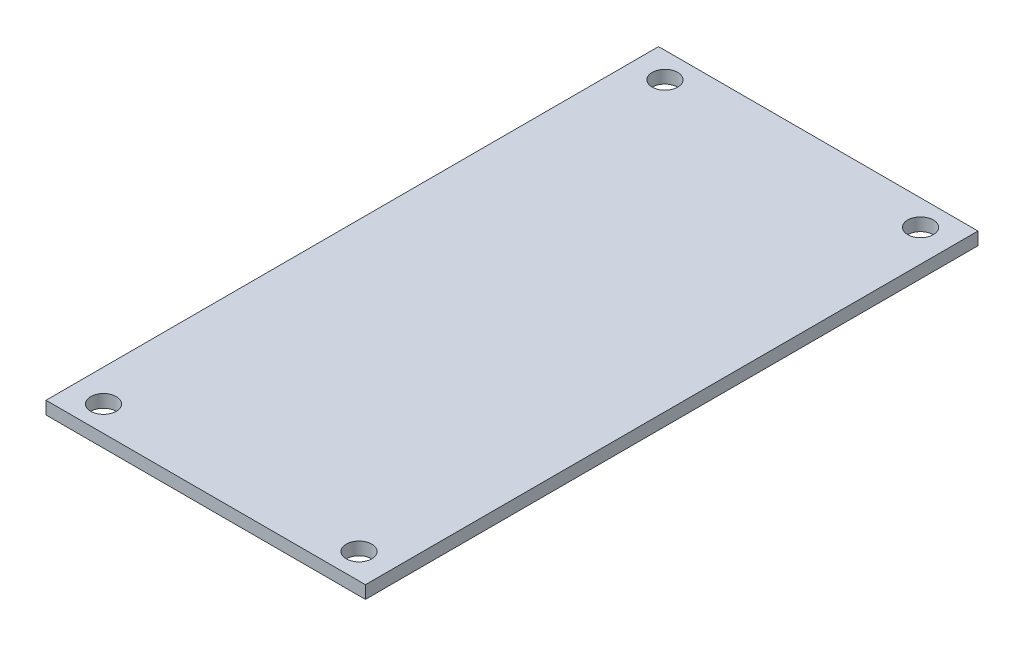
ISO-10303-21;
HEADER;
FILE_DESCRIPTION(('STEP AP214'),'2;1');
FILE_NAME('part.step','',(''),(''),'','','');
FILE_SCHEMA(('AUTOMOTIVE_DESIGN { 1 0 10303 214 1 1 1 1 }'));
ENDSEC;
DATA;
#1=APPLICATION_CONTEXT('core data for automotive mechanical design processes');
#2=APPLICATION_PROTOCOL_DEFINITION('international standard','automotive_design',2000,#1);
#3=PRODUCT_CONTEXT('',#1,'mechanical');
#4=PRODUCT('Part','Part','',(#3));
#5=PRODUCT_RELATED_PRODUCT_CATEGORY('part','',(#4));
#6=PRODUCT_DEFINITION_FORMATION('','',#4);
#7=PRODUCT_DEFINITION_CONTEXT('part definition',#1,'design');
#8=PRODUCT_DEFINITION('design','',#6,#7);
#9=PRODUCT_DEFINITION_SHAPE('','',#8);
#10=(LENGTH_UNIT() NAMED_UNIT(*) SI_UNIT(.MILLI.,.METRE.));
#11=(NAMED_UNIT(*) PLANE_ANGLE_UNIT() SI_UNIT($,.RADIAN.));
#12=(NAMED_UNIT(*) SI_UNIT($,.STERADIAN.) SOLID_ANGLE_UNIT());
#13=UNCERTAINTY_MEASURE_WITH_UNIT(LENGTH_MEASURE(1.E-05),#10,'distance_accuracy_value','');
#14=(GEOMETRIC_REPRESENTATION_CONTEXT(3) GLOBAL_UNCERTAINTY_ASSIGNED_CONTEXT((#13)) GLOBAL_UNIT_ASSIGNED_CONTEXT((#10,
#11,#12)) REPRESENTATION_CONTEXT('',''));
#15=CARTESIAN_POINT('',(0.,0.,0.));
#16=DIRECTION('',(0.,0.,1.));
#17=DIRECTION('',(1.,0.,0.));
#18=AXIS2_PLACEMENT_3D('',#15,#16,#17);
#19=CARTESIAN_POINT('',(0.,5.,0.));
#20=DIRECTION('',(1.,0.,0.));
#21=DIRECTION('',(0.,0.,-1.));
#22=AXIS2_PLACEMENT_3D('',#19,#20,#21);
#23=PLANE('',#22);
#24=DIRECTION('',(0.,0.,1.));
#25=VECTOR('',#24,1.);
#26=CARTESIAN_POINT('',(0.,0.,0.));
#27=LINE('',#26,#25);
#28=CARTESIAN_POINT('',(0.,0.,0.));
#29=VERTEX_POINT('',#28);
#30=CARTESIAN_POINT('',(0.,0.,239.7125));
#31=VERTEX_POINT('',#30);
#32=EDGE_CURVE('E105',#29,#31,#27,.T.);
#33=ORIENTED_EDGE('',*,*,#32,.T.);
#34=DIRECTION('',(0.,-1.,0.));
#35=VECTOR('',#34,1.);
#36=CARTESIAN_POINT('',(0.,5.,239.7125));
#37=LINE('',#36,#35);
#38=CARTESIAN_POINT('',(0.,5.,239.7125));
#39=VERTEX_POINT('',#38);
#40=EDGE_CURVE('E11',#39,#31,#37,.T.);
#41=ORIENTED_EDGE('',*,*,#40,.F.);
#42=DIRECTION('',(0.,0.,1.));
#43=VECTOR('',#42,1.);
#44=CARTESIAN_POINT('',(0.,5.,0.));
#45=LINE('',#44,#43);
#46=CARTESIAN_POINT('',(0.,5.,0.));
#47=VERTEX_POINT('',#46);
#48=EDGE_CURVE('E93',#47,#39,#45,.T.);
#49=ORIENTED_EDGE('',*,*,#48,.F.);
#50=DIRECTION('',(0.,-1.,0.));
#51=VECTOR('',#50,1.);
#52=CARTESIAN_POINT('',(0.,5.,0.));
#53=LINE('',#52,#51);
#54=EDGE_CURVE('E101',#47,#29,#53,.T.);
#55=ORIENTED_EDGE('',*,*,#54,.T.);
#56=EDGE_LOOP('',(#33,#41,#49,#55));
#57=FACE_BOUND('',#56,.T.);
#58=ADVANCED_FACE('F42',(#57),#23,.F.);
#59=CARTESIAN_POINT('',(0.,5.,239.7125));
#60=DIRECTION('',(0.,0.,-1.));
#61=DIRECTION('',(-1.,0.,0.));
#62=AXIS2_PLACEMENT_3D('',#59,#60,#61);
#63=PLANE('',#62);
#64=DIRECTION('',(1.,0.,0.));
#65=VECTOR('',#64,1.);
#66=CARTESIAN_POINT('',(0.,0.,239.7125));
#67=LINE('',#66,#65);
#68=CARTESIAN_POINT('',(125.,0.,239.7125));
#69=VERTEX_POINT('',#68);
#70=EDGE_CURVE('E97',#31,#69,#67,.T.);
#71=ORIENTED_EDGE('',*,*,#70,.T.);
#72=DIRECTION('',(0.,-1.,0.));
#73=VECTOR('',#72,1.);
#74=CARTESIAN_POINT('',(125.,5.,239.7125));
#75=LINE('',#74,#73);
#76=CARTESIAN_POINT('',(125.,5.,239.7125));
#77=VERTEX_POINT('',#76);
#78=EDGE_CURVE('E50',#77,#69,#75,.T.);
#79=ORIENTED_EDGE('',*,*,#78,.F.);
#80=DIRECTION('',(1.,0.,0.));
#81=VECTOR('',#80,1.);
#82=CARTESIAN_POINT('',(0.,5.,239.7125));
#83=LINE('',#82,#81);
#84=EDGE_CURVE('E88',#39,#77,#83,.T.);
#85=ORIENTED_EDGE('',*,*,#84,.F.);
#86=ORIENTED_EDGE('',*,*,#40,.T.);
#87=EDGE_LOOP('',(#71,#79,#85,#86));
#88=FACE_BOUND('',#87,.T.);
#89=ADVANCED_FACE('F96',(#88),#63,.F.);
#90=CARTESIAN_POINT('',(125.,5.,0.));
#91=DIRECTION('',(-1.,0.,0.));
#92=DIRECTION('',(0.,0.,1.));
#93=AXIS2_PLACEMENT_3D('',#90,#91,#92);
#94=PLANE('',#93);
#95=DIRECTION('',(0.,0.,-1.));
#96=VECTOR('',#95,1.);
#97=CARTESIAN_POINT('',(125.,0.,0.));
#98=LINE('',#97,#96);
#99=CARTESIAN_POINT('',(125.,0.,0.));
#100=VERTEX_POINT('',#99);
#101=EDGE_CURVE('E75',#69,#100,#98,.T.);
#102=ORIENTED_EDGE('',*,*,#101,.T.);
#103=DIRECTION('',(0.,-1.,0.));
#104=VECTOR('',#103,1.);
#105=CARTESIAN_POINT('',(125.,5.,0.));
#106=LINE('',#105,#104);
#107=CARTESIAN_POINT('',(125.,5.,0.));
#108=VERTEX_POINT('',#107);
#109=EDGE_CURVE('E98',#108,#100,#106,.T.);
#110=ORIENTED_EDGE('',*,*,#109,.F.);
#111=DIRECTION('',(0.,0.,-1.));
#112=VECTOR('',#111,1.);
#113=CARTESIAN_POINT('',(125.,5.,0.));
#114=LINE('',#113,#112);
#115=EDGE_CURVE('E91',#77,#108,#114,.T.);
#116=ORIENTED_EDGE('',*,*,#115,.F.);
#117=ORIENTED_EDGE('',*,*,#78,.T.);
#118=EDGE_LOOP('',(#102,#110,#116,#117));
#119=FACE_BOUND('',#118,.T.);
#120=ADVANCED_FACE('F99',(#119),#94,.F.);
#121=CARTESIAN_POINT('',(0.,5.,0.));
#122=DIRECTION('',(0.,0.,1.));
#123=DIRECTION('',(1.,0.,0.));
#124=AXIS2_PLACEMENT_3D('',#121,#122,#123);
#125=PLANE('',#124);
#126=DIRECTION('',(-1.,0.,0.));
#127=VECTOR('',#126,1.);
#128=CARTESIAN_POINT('',(0.,0.,0.));
#129=LINE('',#128,#127);
#130=EDGE_CURVE('E81',#100,#29,#129,.T.);
#131=ORIENTED_EDGE('',*,*,#130,.T.);
#132=ORIENTED_EDGE('',*,*,#54,.F.);
#133=DIRECTION('',(-1.,0.,0.));
#134=VECTOR('',#133,1.);
#135=CARTESIAN_POINT('',(0.,5.,0.));
#136=LINE('',#135,#134);
#137=EDGE_CURVE('E58',#108,#47,#136,.T.);
#138=ORIENTED_EDGE('',*,*,#137,.F.);
#139=ORIENTED_EDGE('',*,*,#109,.T.);
#140=EDGE_LOOP('',(#131,#132,#138,#139));
#141=FACE_BOUND('',#140,.T.);
#142=ADVANCED_FACE('F113',(#141),#125,.F.);
#143=CARTESIAN_POINT('',(0.,5.,0.));
#144=DIRECTION('',(0.,1.,0.));
#145=DIRECTION('',(0.,0.,1.));
#146=AXIS2_PLACEMENT_3D('',#143,#144,#145);
#147=PLANE('',#146);
#148=CARTESIAN_POINT('',(112.5,5.,229.7125));
#149=DIRECTION('',(0.,1.,0.));
#150=DIRECTION('',(0.,0.,1.));
#151=AXIS2_PLACEMENT_3D('',#148,#149,#150);
#152=CIRCLE('',#151,5.00000000000001);
#153=CARTESIAN_POINT('',(112.5,5.,234.7125));
#154=VERTEX_POINT('',#153);
#155=EDGE_CURVE('E122',#154,#154,#152,.F.);
#156=ORIENTED_EDGE('',*,*,#155,.T.);
#157=EDGE_LOOP('',(#156));
#158=FACE_BOUND('',#157,.T.);
#159=CARTESIAN_POINT('',(12.5,5.,10.));
#160=DIRECTION('',(0.,1.,0.));
#161=DIRECTION('',(0.,0.,1.));
#162=AXIS2_PLACEMENT_3D('',#159,#160,#161);
#163=CIRCLE('',#162,5.);
#164=CARTESIAN_POINT('',(12.5,5.,15.));
#165=VERTEX_POINT('',#164);
#166=EDGE_CURVE('E128',#165,#165,#163,.F.);
#167=ORIENTED_EDGE('',*,*,#166,.T.);
#168=EDGE_LOOP('',(#167));
#169=FACE_BOUND('',#168,.T.);
#170=CARTESIAN_POINT('',(112.5,5.,10.));
#171=DIRECTION('',(0.,1.,0.));
#172=DIRECTION('',(0.,0.,1.));
#173=AXIS2_PLACEMENT_3D('',#170,#171,#172);
#174=CIRCLE('',#173,5.);
#175=CARTESIAN_POINT('',(112.5,5.,15.));
#176=VERTEX_POINT('',#175);
#177=EDGE_CURVE('E129',#176,#176,#174,.F.);
#178=ORIENTED_EDGE('',*,*,#177,.T.);
#179=EDGE_LOOP('',(#178));
#180=FACE_BOUND('',#179,.T.);
#181=CARTESIAN_POINT('',(12.5,5.,229.7125));
#182=DIRECTION('',(0.,1.,0.));
#183=DIRECTION('',(0.,0.,1.));
#184=AXIS2_PLACEMENT_3D('',#181,#182,#183);
#185=CIRCLE('',#184,5.);
#186=CARTESIAN_POINT('',(12.5,5.,234.7125));
#187=VERTEX_POINT('',#186);
#188=EDGE_CURVE('E119',#187,#187,#185,.F.);
#189=ORIENTED_EDGE('',*,*,#188,.T.);
#190=EDGE_LOOP('',(#189));
#191=FACE_BOUND('',#190,.T.);
#192=ORIENTED_EDGE('',*,*,#48,.T.);
#193=ORIENTED_EDGE('',*,*,#84,.T.);
#194=ORIENTED_EDGE('',*,*,#115,.T.);
#195=ORIENTED_EDGE('',*,*,#137,.T.);
#196=EDGE_LOOP('',(#192,#193,#194,#195));
#197=FACE_BOUND('',#196,.T.);
#198=ADVANCED_FACE('F89',(#158,#169,#180,#191,#197),#147,.T.);
#199=CARTESIAN_POINT('',(0.,0.,0.));
#200=DIRECTION('',(0.,1.,0.));
#201=DIRECTION('',(0.,0.,1.));
#202=AXIS2_PLACEMENT_3D('',#199,#200,#201);
#203=PLANE('',#202);
#204=CARTESIAN_POINT('',(112.5,0.,229.7125));
#205=DIRECTION('',(0.,-1.,0.));
#206=DIRECTION('',(0.,0.,-1.));
#207=AXIS2_PLACEMENT_3D('',#204,#205,#206);
#208=CIRCLE('',#207,5.00000000000001);
#209=CARTESIAN_POINT('',(112.5,0.,224.7125));
#210=VERTEX_POINT('',#209);
#211=EDGE_CURVE('E132',#210,#210,#208,.T.);
#212=ORIENTED_EDGE('',*,*,#211,.F.);
#213=EDGE_LOOP('',(#212));
#214=FACE_BOUND('',#213,.T.);
#215=CARTESIAN_POINT('',(12.5,0.,10.));
#216=DIRECTION('',(0.,-1.,0.));
#217=DIRECTION('',(0.,0.,-1.));
#218=AXIS2_PLACEMENT_3D('',#215,#216,#217);
#219=CIRCLE('',#218,5.);
#220=CARTESIAN_POINT('',(12.5,0.,5.));
#221=VERTEX_POINT('',#220);
#222=EDGE_CURVE('E125',#221,#221,#219,.T.);
#223=ORIENTED_EDGE('',*,*,#222,.F.);
#224=EDGE_LOOP('',(#223));
#225=FACE_BOUND('',#224,.T.);
#226=CARTESIAN_POINT('',(112.5,0.,10.));
#227=DIRECTION('',(0.,-1.,0.));
#228=DIRECTION('',(0.,0.,-1.));
#229=AXIS2_PLACEMENT_3D('',#226,#227,#228);
#230=CIRCLE('',#229,5.);
#231=CARTESIAN_POINT('',(112.5,0.,5.));
#232=VERTEX_POINT('',#231);
#233=EDGE_CURVE('E137',#232,#232,#230,.T.);
#234=ORIENTED_EDGE('',*,*,#233,.F.);
#235=EDGE_LOOP('',(#234));
#236=FACE_BOUND('',#235,.T.);
#237=CARTESIAN_POINT('',(12.5,0.,229.7125));
#238=DIRECTION('',(0.,-1.,0.));
#239=DIRECTION('',(0.,0.,-1.));
#240=AXIS2_PLACEMENT_3D('',#237,#238,#239);
#241=CIRCLE('',#240,5.);
#242=CARTESIAN_POINT('',(12.5,0.,224.7125));
#243=VERTEX_POINT('',#242);
#244=EDGE_CURVE('E108',#243,#243,#241,.T.);
#245=ORIENTED_EDGE('',*,*,#244,.F.);
#246=EDGE_LOOP('',(#245));
#247=FACE_BOUND('',#246,.T.);
#248=ORIENTED_EDGE('',*,*,#32,.F.);
#249=ORIENTED_EDGE('',*,*,#130,.F.);
#250=ORIENTED_EDGE('',*,*,#101,.F.);
#251=ORIENTED_EDGE('',*,*,#70,.F.);
#252=EDGE_LOOP('',(#248,#249,#250,#251));
#253=FACE_BOUND('',#252,.T.);
#254=ADVANCED_FACE('F116',(#214,#225,#236,#247,#253),#203,.F.);
#255=CARTESIAN_POINT('',(12.5,5.001,229.7125));
#256=DIRECTION('',(0.,-1.,0.));
#257=DIRECTION('',(0.,0.,-1.));
#258=AXIS2_PLACEMENT_3D('',#255,#256,#257);
#259=CYLINDRICAL_SURFACE('',#258,5.);
#260=ORIENTED_EDGE('',*,*,#188,.F.);
#261=EDGE_LOOP('',(#260));
#262=FACE_BOUND('',#261,.T.);
#263=ORIENTED_EDGE('',*,*,#244,.T.);
#264=EDGE_LOOP('',(#263));
#265=FACE_BOUND('',#264,.T.);
#266=ADVANCED_FACE('F149',(#262,#265),#259,.F.);
#267=CARTESIAN_POINT('',(112.5,5.001,10.));
#268=DIRECTION('',(0.,-1.,0.));
#269=DIRECTION('',(0.,0.,-1.));
#270=AXIS2_PLACEMENT_3D('',#267,#268,#269);
#271=CYLINDRICAL_SURFACE('',#270,5.);
#272=ORIENTED_EDGE('',*,*,#177,.F.);
#273=EDGE_LOOP('',(#272));
#274=FACE_BOUND('',#273,.T.);
#275=ORIENTED_EDGE('',*,*,#233,.T.);
#276=EDGE_LOOP('',(#275));
#277=FACE_BOUND('',#276,.T.);
#278=ADVANCED_FACE('F145',(#274,#277),#271,.F.);
#279=CARTESIAN_POINT('',(12.5,5.001,10.));
#280=DIRECTION('',(0.,-1.,0.));
#281=DIRECTION('',(0.,0.,-1.));
#282=AXIS2_PLACEMENT_3D('',#279,#280,#281);
#283=CYLINDRICAL_SURFACE('',#282,5.);
#284=ORIENTED_EDGE('',*,*,#166,.F.);
#285=EDGE_LOOP('',(#284));
#286=FACE_BOUND('',#285,.T.);
#287=ORIENTED_EDGE('',*,*,#222,.T.);
#288=EDGE_LOOP('',(#287));
#289=FACE_BOUND('',#288,.T.);
#290=ADVANCED_FACE('F148',(#286,#289),#283,.F.);
#291=CARTESIAN_POINT('',(112.5,5.001,229.7125));
#292=DIRECTION('',(0.,-1.,0.));
#293=DIRECTION('',(0.,0.,-1.));
#294=AXIS2_PLACEMENT_3D('',#291,#292,#293);
#295=CYLINDRICAL_SURFACE('',#294,5.00000000000001);
#296=ORIENTED_EDGE('',*,*,#155,.F.);
#297=EDGE_LOOP('',(#296));
#298=FACE_BOUND('',#297,.T.);
#299=ORIENTED_EDGE('',*,*,#211,.T.);
#300=EDGE_LOOP('',(#299));
#301=FACE_BOUND('',#300,.T.);
#302=ADVANCED_FACE('F187',(#298,#301),#295,.F.);
#303=CLOSED_SHELL('',(#58,#89,#120,#142,#198,#254,#266,#278,#290,#302));
#304=MANIFOLD_SOLID_BREP('B2',#303);
#305=ADVANCED_BREP_SHAPE_REPRESENTATION('',(#18,#304),#14);
#306=SHAPE_DEFINITION_REPRESENTATION(#9,#305);
ENDSEC;
END-ISO-10303-21;
